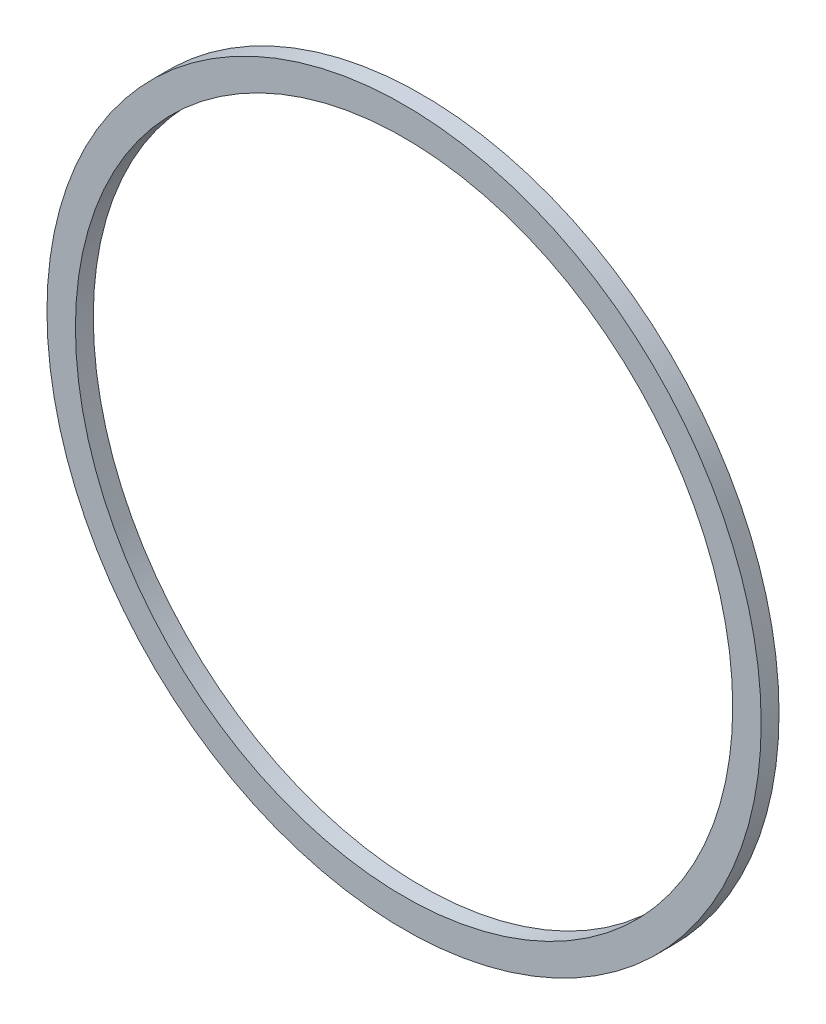
ISO-10303-21;
HEADER;
FILE_DESCRIPTION(('STEP AP214'),'2;1');
FILE_NAME('part.step','',(''),(''),'','','');
FILE_SCHEMA(('AUTOMOTIVE_DESIGN { 1 0 10303 214 1 1 1 1 }'));
ENDSEC;
DATA;
#1=APPLICATION_CONTEXT('core data for automotive mechanical design processes');
#2=APPLICATION_PROTOCOL_DEFINITION('international standard','automotive_design',2000,#1);
#3=PRODUCT_CONTEXT('',#1,'mechanical');
#4=PRODUCT('Part','Part','',(#3));
#5=PRODUCT_RELATED_PRODUCT_CATEGORY('part','',(#4));
#6=PRODUCT_DEFINITION_FORMATION('','',#4);
#7=PRODUCT_DEFINITION_CONTEXT('part definition',#1,'design');
#8=PRODUCT_DEFINITION('design','',#6,#7);
#9=PRODUCT_DEFINITION_SHAPE('','',#8);
#10=(LENGTH_UNIT() NAMED_UNIT(*) SI_UNIT(.MILLI.,.METRE.));
#11=(NAMED_UNIT(*) PLANE_ANGLE_UNIT() SI_UNIT($,.RADIAN.));
#12=(NAMED_UNIT(*) SI_UNIT($,.STERADIAN.) SOLID_ANGLE_UNIT());
#13=UNCERTAINTY_MEASURE_WITH_UNIT(LENGTH_MEASURE(1.E-05),#10,'distance_accuracy_value','');
#14=(GEOMETRIC_REPRESENTATION_CONTEXT(3) GLOBAL_UNCERTAINTY_ASSIGNED_CONTEXT((#13)) GLOBAL_UNIT_ASSIGNED_CONTEXT((#10,
#11,#12)) REPRESENTATION_CONTEXT('',''));
#15=CARTESIAN_POINT('',(0.,0.,0.));
#16=DIRECTION('',(0.,0.,1.));
#17=DIRECTION('',(1.,0.,0.));
#18=AXIS2_PLACEMENT_3D('',#15,#16,#17);
#19=CARTESIAN_POINT('',(0.,0.,6.35));
#20=DIRECTION('',(0.,0.,1.));
#21=DIRECTION('',(1.,0.,0.));
#22=AXIS2_PLACEMENT_3D('',#19,#20,#21);
#23=PLANE('',#22);
#24=CARTESIAN_POINT('',(0.,0.,6.35));
#25=DIRECTION('',(0.,0.,1.));
#26=DIRECTION('',(1.,0.,0.));
#27=AXIS2_PLACEMENT_3D('',#24,#25,#26);
#28=CIRCLE('',#27,127.);
#29=CARTESIAN_POINT('',(127.,0.,6.35));
#30=VERTEX_POINT('',#29);
#31=EDGE_CURVE('E10',#30,#30,#28,.T.);
#32=ORIENTED_EDGE('',*,*,#31,.T.);
#33=EDGE_LOOP('',(#32));
#34=FACE_BOUND('',#33,.T.);
#35=CARTESIAN_POINT('',(0.,0.,6.35));
#36=DIRECTION('',(0.,0.,1.));
#37=DIRECTION('',(1.,0.,0.));
#38=AXIS2_PLACEMENT_3D('',#35,#36,#37);
#39=CIRCLE('',#38,116.88);
#40=CARTESIAN_POINT('',(116.88,0.,6.35));
#41=VERTEX_POINT('',#40);
#42=EDGE_CURVE('E54',#41,#41,#39,.T.);
#43=ORIENTED_EDGE('',*,*,#42,.F.);
#44=EDGE_LOOP('',(#43));
#45=FACE_BOUND('',#44,.T.);
#46=ADVANCED_FACE('F41',(#34,#45),#23,.T.);
#47=CARTESIAN_POINT('',(0.,0.,0.));
#48=DIRECTION('',(0.,0.,1.));
#49=DIRECTION('',(1.,0.,0.));
#50=AXIS2_PLACEMENT_3D('',#47,#48,#49);
#51=PLANE('',#50);
#52=CARTESIAN_POINT('',(0.,0.,0.));
#53=DIRECTION('',(0.,0.,1.));
#54=DIRECTION('',(1.,0.,0.));
#55=AXIS2_PLACEMENT_3D('',#52,#53,#54);
#56=CIRCLE('',#55,127.);
#57=CARTESIAN_POINT('',(127.,0.,0.));
#58=VERTEX_POINT('',#57);
#59=EDGE_CURVE('E45',#58,#58,#56,.T.);
#60=ORIENTED_EDGE('',*,*,#59,.F.);
#61=EDGE_LOOP('',(#60));
#62=FACE_BOUND('',#61,.T.);
#63=CARTESIAN_POINT('',(0.,0.,0.));
#64=DIRECTION('',(0.,0.,1.));
#65=DIRECTION('',(1.,0.,0.));
#66=AXIS2_PLACEMENT_3D('',#63,#64,#65);
#67=CIRCLE('',#66,116.88);
#68=CARTESIAN_POINT('',(116.88,0.,0.));
#69=VERTEX_POINT('',#68);
#70=EDGE_CURVE('E56',#69,#69,#67,.T.);
#71=ORIENTED_EDGE('',*,*,#70,.T.);
#72=EDGE_LOOP('',(#71));
#73=FACE_BOUND('',#72,.T.);
#74=ADVANCED_FACE('F68',(#62,#73),#51,.F.);
#75=CARTESIAN_POINT('',(0.,0.,6.35));
#76=DIRECTION('',(0.,0.,-1.));
#77=DIRECTION('',(-1.,0.,0.));
#78=AXIS2_PLACEMENT_3D('',#75,#76,#77);
#79=CYLINDRICAL_SURFACE('',#78,127.);
#80=ORIENTED_EDGE('',*,*,#31,.F.);
#81=EDGE_LOOP('',(#80));
#82=FACE_BOUND('',#81,.T.);
#83=ORIENTED_EDGE('',*,*,#59,.T.);
#84=EDGE_LOOP('',(#83));
#85=FACE_BOUND('',#84,.T.);
#86=ADVANCED_FACE('F43',(#82,#85),#79,.T.);
#87=CARTESIAN_POINT('',(0.,0.,6.35));
#88=DIRECTION('',(0.,0.,-1.));
#89=DIRECTION('',(-1.,0.,0.));
#90=AXIS2_PLACEMENT_3D('',#87,#88,#89);
#91=CYLINDRICAL_SURFACE('',#90,116.88);
#92=ORIENTED_EDGE('',*,*,#42,.T.);
#93=EDGE_LOOP('',(#92));
#94=FACE_BOUND('',#93,.T.);
#95=ORIENTED_EDGE('',*,*,#70,.F.);
#96=EDGE_LOOP('',(#95));
#97=FACE_BOUND('',#96,.T.);
#98=ADVANCED_FACE('F64',(#94,#97),#91,.F.);
#99=CLOSED_SHELL('',(#46,#74,#86,#98));
#100=MANIFOLD_SOLID_BREP('B2',#99);
#101=ADVANCED_BREP_SHAPE_REPRESENTATION('',(#18,#100),#14);
#102=SHAPE_DEFINITION_REPRESENTATION(#9,#101);
ENDSEC;
END-ISO-10303-21;
